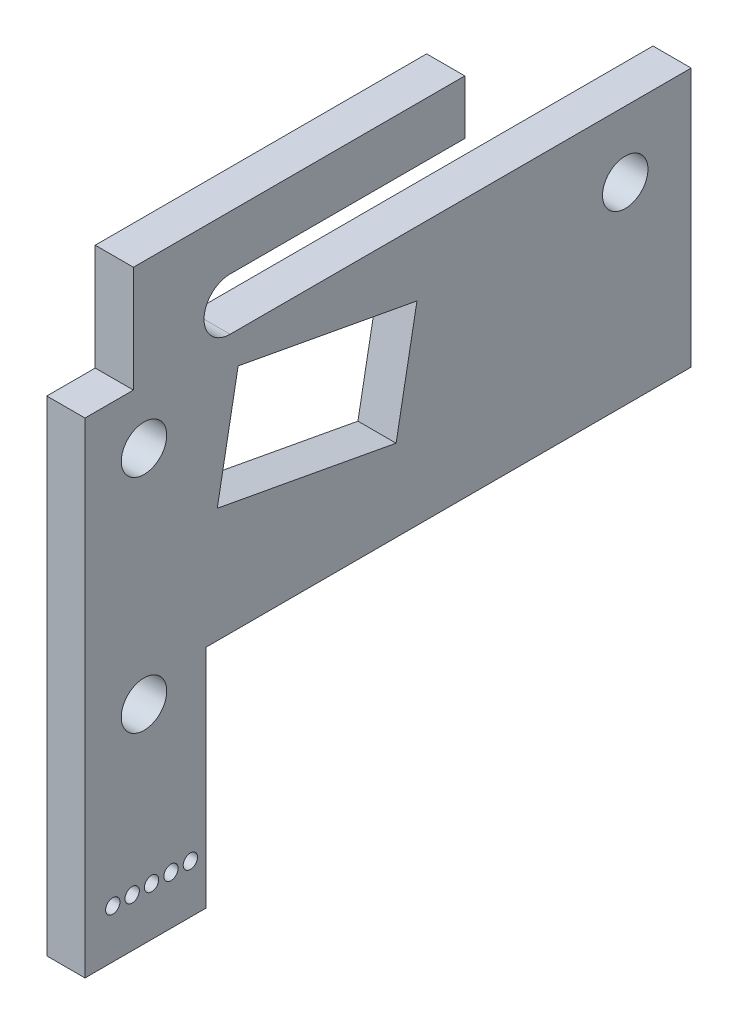
ISO-10303-21;
HEADER;
FILE_DESCRIPTION(('STEP AP214'),'2;1');
FILE_NAME('part.step','',(''),(''),'','','');
FILE_SCHEMA(('AUTOMOTIVE_DESIGN { 1 0 10303 214 1 1 1 1 }'));
ENDSEC;
DATA;
#1=APPLICATION_CONTEXT('core data for automotive mechanical design processes');
#2=APPLICATION_PROTOCOL_DEFINITION('international standard','automotive_design',2000,#1);
#3=PRODUCT_CONTEXT('',#1,'mechanical');
#4=PRODUCT('Part','Part','',(#3));
#5=PRODUCT_RELATED_PRODUCT_CATEGORY('part','',(#4));
#6=PRODUCT_DEFINITION_FORMATION('','',#4);
#7=PRODUCT_DEFINITION_CONTEXT('part definition',#1,'design');
#8=PRODUCT_DEFINITION('design','',#6,#7);
#9=PRODUCT_DEFINITION_SHAPE('','',#8);
#10=(LENGTH_UNIT() NAMED_UNIT(*) SI_UNIT(.MILLI.,.METRE.));
#11=(NAMED_UNIT(*) PLANE_ANGLE_UNIT() SI_UNIT($,.RADIAN.));
#12=(NAMED_UNIT(*) SI_UNIT($,.STERADIAN.) SOLID_ANGLE_UNIT());
#13=UNCERTAINTY_MEASURE_WITH_UNIT(LENGTH_MEASURE(1.E-05),#10,'distance_accuracy_value','');
#14=(GEOMETRIC_REPRESENTATION_CONTEXT(3) GLOBAL_UNCERTAINTY_ASSIGNED_CONTEXT((#13)) GLOBAL_UNIT_ASSIGNED_CONTEXT((#10,
#11,#12)) REPRESENTATION_CONTEXT('',''));
#15=CARTESIAN_POINT('',(0.,0.,0.));
#16=DIRECTION('',(0.,0.,1.));
#17=DIRECTION('',(1.,0.,0.));
#18=AXIS2_PLACEMENT_3D('',#15,#16,#17);
#19=CARTESIAN_POINT('',(2.,9.64169691409352,41.3883309004574));
#20=DIRECTION('',(-1.,0.,0.));
#21=DIRECTION('',(0.,0.,1.));
#22=AXIS2_PLACEMENT_3D('',#19,#20,#21);
#23=PLANE('',#22);
#24=CARTESIAN_POINT('',(2.,-38.8104127217883,53.6809582242048));
#25=DIRECTION('',(1.,0.,0.));
#26=DIRECTION('',(0.,0.,-1.));
#27=AXIS2_PLACEMENT_3D('',#24,#25,#26);
#28=CIRCLE('',#27,0.749999999999999);
#29=CARTESIAN_POINT('',(2.,-38.8104127217883,52.9309582242048));
#30=VERTEX_POINT('',#29);
#31=EDGE_CURVE('E188',#30,#30,#28,.T.);
#32=ORIENTED_EDGE('',*,*,#31,.F.);
#33=EDGE_LOOP('',(#32));
#34=FACE_BOUND('',#33,.T.);
#35=CARTESIAN_POINT('',(2.,0.,0.));
#36=DIRECTION('',(1.,0.,0.));
#37=DIRECTION('',(0.,0.,-1.));
#38=AXIS2_PLACEMENT_3D('',#35,#36,#37);
#39=CIRCLE('',#38,2.38125);
#40=CARTESIAN_POINT('',(2.,0.,-2.38125));
#41=VERTEX_POINT('',#40);
#42=EDGE_CURVE('E194',#41,#41,#39,.T.);
#43=ORIENTED_EDGE('',*,*,#42,.F.);
#44=EDGE_LOOP('',(#43));
#45=FACE_BOUND('',#44,.T.);
#46=DIRECTION('',(0.,-1.,0.));
#47=VECTOR('',#46,1.);
#48=CARTESIAN_POINT('',(2.,6.90958727821171,56.5904127217883));
#49=LINE('',#48,#47);
#50=CARTESIAN_POINT('',(2.,6.90958727821171,56.5904127217883));
#51=VERTEX_POINT('',#50);
#52=CARTESIAN_POINT('',(2.,-43.8904127217883,56.5904127217883));
#53=VERTEX_POINT('',#52);
#54=EDGE_CURVE('E200',#51,#53,#49,.T.);
#55=ORIENTED_EDGE('',*,*,#54,.T.);
#56=DIRECTION('',(0.,0.,-1.));
#57=VECTOR('',#56,1.);
#58=CARTESIAN_POINT('',(2.,-43.8904127217883,56.5904127217883));
#59=LINE('',#58,#57);
#60=CARTESIAN_POINT('',(2.,-43.8904127217883,43.8904127217883));
#61=VERTEX_POINT('',#60);
#62=EDGE_CURVE('E203',#53,#61,#59,.T.);
#63=ORIENTED_EDGE('',*,*,#62,.T.);
#64=DIRECTION('',(0.,1.,0.));
#65=VECTOR('',#64,1.);
#66=CARTESIAN_POINT('',(2.,-43.8904127217883,43.8904127217883));
#67=LINE('',#66,#65);
#68=CARTESIAN_POINT('',(2.,-20.2220575827776,43.8904127217883));
#69=VERTEX_POINT('',#68);
#70=EDGE_CURVE('E206',#61,#69,#67,.T.);
#71=ORIENTED_EDGE('',*,*,#70,.T.);
#72=DIRECTION('',(0.,0.,-1.));
#73=VECTOR('',#72,1.);
#74=CARTESIAN_POINT('',(2.,-20.2220575827776,43.8904127217883));
#75=LINE('',#74,#73);
#76=CARTESIAN_POINT('',(2.,-20.2220575827776,-6.90958727821172));
#77=VERTEX_POINT('',#76);
#78=EDGE_CURVE('E208',#69,#77,#75,.T.);
#79=ORIENTED_EDGE('',*,*,#78,.T.);
#80=DIRECTION('',(0.,1.,0.));
#81=VECTOR('',#80,1.);
#82=CARTESIAN_POINT('',(2.,-20.2220575827776,-6.90958727821172));
#83=LINE('',#82,#81);
#84=CARTESIAN_POINT('',(2.,6.90958727821172,-6.90958727821172));
#85=VERTEX_POINT('',#84);
#86=EDGE_CURVE('E210',#77,#85,#83,.T.);
#87=ORIENTED_EDGE('',*,*,#86,.T.);
#88=DIRECTION('',(0.,0.,1.));
#89=VECTOR('',#88,1.);
#90=CARTESIAN_POINT('',(2.,6.90958727821171,41.3883309004574));
#91=LINE('',#90,#89);
#92=CARTESIAN_POINT('',(2.,6.90958727821171,41.3883309004574));
#93=VERTEX_POINT('',#92);
#94=EDGE_CURVE('E212',#85,#93,#91,.T.);
#95=ORIENTED_EDGE('',*,*,#94,.T.);
#96=CARTESIAN_POINT('',(2.,9.64169691409352,41.3883309004574));
#97=DIRECTION('',(-1.,0.,0.));
#98=DIRECTION('',(0.,0.,1.));
#99=AXIS2_PLACEMENT_3D('',#96,#97,#98);
#100=CIRCLE('',#99,2.73210963588181);
#101=CARTESIAN_POINT('',(2.,12.3738065499753,41.3883309004574));
#102=VERTEX_POINT('',#101);
#103=EDGE_CURVE('E214',#93,#102,#100,.T.);
#104=ORIENTED_EDGE('',*,*,#103,.T.);
#105=DIRECTION('',(0.,0.,-1.));
#106=VECTOR('',#105,1.);
#107=CARTESIAN_POINT('',(2.,12.3738065499753,41.3883309004574));
#108=LINE('',#107,#106);
#109=CARTESIAN_POINT('',(2.,12.3738065499753,16.8039920927754));
#110=VERTEX_POINT('',#109);
#111=EDGE_CURVE('E216',#102,#110,#108,.T.);
#112=ORIENTED_EDGE('',*,*,#111,.T.);
#113=DIRECTION('',(0.,1.,0.));
#114=VECTOR('',#113,1.);
#115=CARTESIAN_POINT('',(2.,12.3738065499753,16.8039920927754));
#116=LINE('',#115,#114);
#117=CARTESIAN_POINT('',(2.,18.0537156021804,16.8039920927754));
#118=VERTEX_POINT('',#117);
#119=EDGE_CURVE('E218',#110,#118,#116,.T.);
#120=ORIENTED_EDGE('',*,*,#119,.T.);
#121=DIRECTION('',(0.,0.,1.));
#122=VECTOR('',#121,1.);
#123=CARTESIAN_POINT('',(2.,18.0537156021804,16.8039920927754));
#124=LINE('',#123,#122);
#125=CARTESIAN_POINT('',(2.,18.0537156021804,51.5186087794746));
#126=VERTEX_POINT('',#125);
#127=EDGE_CURVE('E220',#118,#126,#124,.T.);
#128=ORIENTED_EDGE('',*,*,#127,.T.);
#129=DIRECTION('',(0.,-1.,0.));
#130=VECTOR('',#129,1.);
#131=CARTESIAN_POINT('',(2.,18.0537156021804,51.5186087794746));
#132=LINE('',#131,#130);
#133=CARTESIAN_POINT('',(2.,6.90958727821171,51.5186087794746));
#134=VERTEX_POINT('',#133);
#135=EDGE_CURVE('E222',#126,#134,#132,.T.);
#136=ORIENTED_EDGE('',*,*,#135,.T.);
#137=DIRECTION('',(0.,0.,1.));
#138=VECTOR('',#137,1.);
#139=CARTESIAN_POINT('',(2.,6.90958727821171,56.5904127217883));
#140=LINE('',#139,#138);
#141=EDGE_CURVE('E224',#134,#51,#140,.T.);
#142=ORIENTED_EDGE('',*,*,#141,.T.);
#143=EDGE_LOOP('',(#55,#63,#71,#79,#87,#95,#104,#112,#120,#128,#136,#142));
#144=FACE_BOUND('',#143,.T.);
#145=DIRECTION('',(0.,-0.983319763651573,0.181885245174571));
#146=VECTOR('',#145,1.);
#147=CARTESIAN_POINT('',(2.,3.61240817228016,40.5478550171507));
#148=LINE('',#147,#146);
#149=CARTESIAN_POINT('',(2.,3.61240817228016,40.5478550171507));
#150=VERTEX_POINT('',#149);
#151=CARTESIAN_POINT('',(2.,-8.20328656154539,42.73341114346));
#152=VERTEX_POINT('',#151);
#153=EDGE_CURVE('E149',#150,#152,#148,.T.);
#154=ORIENTED_EDGE('',*,*,#153,.F.);
#155=DIRECTION('',(0.,0.181885245174571,0.983319763651574));
#156=VECTOR('',#155,1.);
#157=CARTESIAN_POINT('',(2.,3.61240817228016,40.5478550171507));
#158=LINE('',#157,#156);
#159=CARTESIAN_POINT('',(2.,0.14749425170459,21.8156135195882));
#160=VERTEX_POINT('',#159);
#161=EDGE_CURVE('E172',#160,#150,#158,.T.);
#162=ORIENTED_EDGE('',*,*,#161,.F.);
#163=DIRECTION('',(0.,0.983319763651573,-0.181885245174571));
#164=VECTOR('',#163,1.);
#165=CARTESIAN_POINT('',(2.,0.147494251704591,21.8156135195882));
#166=LINE('',#165,#164);
#167=CARTESIAN_POINT('',(2.,-11.668200482121,24.0011696458975));
#168=VERTEX_POINT('',#167);
#169=EDGE_CURVE('E170',#168,#160,#166,.T.);
#170=ORIENTED_EDGE('',*,*,#169,.F.);
#171=DIRECTION('',(0.,-0.181885245174571,-0.983319763651574));
#172=VECTOR('',#171,1.);
#173=CARTESIAN_POINT('',(2.,-8.20328656154539,42.73341114346));
#174=LINE('',#173,#172);
#175=EDGE_CURVE('E157',#152,#168,#174,.T.);
#176=ORIENTED_EDGE('',*,*,#175,.F.);
#177=EDGE_LOOP('',(#154,#162,#170,#176));
#178=FACE_BOUND('',#177,.T.);
#179=CARTESIAN_POINT('',(2.,-38.8104127217883,45.5529582242048));
#180=DIRECTION('',(1.,0.,0.));
#181=DIRECTION('',(0.,0.,-1.));
#182=AXIS2_PLACEMENT_3D('',#179,#180,#181);
#183=CIRCLE('',#182,0.749999999999999);
#184=CARTESIAN_POINT('',(2.,-38.8104127217883,44.8029582242048));
#185=VERTEX_POINT('',#184);
#186=EDGE_CURVE('E178',#185,#185,#183,.T.);
#187=ORIENTED_EDGE('',*,*,#186,.F.);
#188=EDGE_LOOP('',(#187));
#189=FACE_BOUND('',#188,.T.);
#190=CARTESIAN_POINT('',(2.,-22.137211246104,50.4101289105847));
#191=DIRECTION('',(1.,0.,0.));
#192=DIRECTION('',(0.,0.,-1.));
#193=AXIS2_PLACEMENT_3D('',#190,#191,#192);
#194=CIRCLE('',#193,2.38125);
#195=CARTESIAN_POINT('',(2.,-22.137211246104,48.0288789105847));
#196=VERTEX_POINT('',#195);
#197=EDGE_CURVE('E599',#196,#196,#194,.T.);
#198=ORIENTED_EDGE('',*,*,#197,.F.);
#199=EDGE_LOOP('',(#198));
#200=FACE_BOUND('',#199,.T.);
#201=CARTESIAN_POINT('',(2.,-38.8104127217883,47.5849582242048));
#202=DIRECTION('',(1.,0.,0.));
#203=DIRECTION('',(0.,0.,-1.));
#204=AXIS2_PLACEMENT_3D('',#201,#202,#203);
#205=CIRCLE('',#204,0.749999999999999);
#206=CARTESIAN_POINT('',(2.,-38.8104127217883,46.8349582242048));
#207=VERTEX_POINT('',#206);
#208=EDGE_CURVE('E593',#207,#207,#205,.T.);
#209=ORIENTED_EDGE('',*,*,#208,.F.);
#210=EDGE_LOOP('',(#209));
#211=FACE_BOUND('',#210,.T.);
#212=CARTESIAN_POINT('',(2.,-38.8104127217883,49.6169582242048));
#213=DIRECTION('',(1.,0.,0.));
#214=DIRECTION('',(0.,0.,-1.));
#215=AXIS2_PLACEMENT_3D('',#212,#213,#214);
#216=CIRCLE('',#215,0.749999999999999);
#217=CARTESIAN_POINT('',(2.,-38.8104127217883,48.8669582242048));
#218=VERTEX_POINT('',#217);
#219=EDGE_CURVE('E587',#218,#218,#216,.T.);
#220=ORIENTED_EDGE('',*,*,#219,.F.);
#221=EDGE_LOOP('',(#220));
#222=FACE_BOUND('',#221,.T.);
#223=CARTESIAN_POINT('',(2.,-38.8104127217883,51.6489582242048));
#224=DIRECTION('',(1.,0.,0.));
#225=DIRECTION('',(0.,0.,-1.));
#226=AXIS2_PLACEMENT_3D('',#223,#224,#225);
#227=CIRCLE('',#226,0.749999999999999);
#228=CARTESIAN_POINT('',(2.,-38.8104127217883,50.8989582242048));
#229=VERTEX_POINT('',#228);
#230=EDGE_CURVE('E581',#229,#229,#227,.T.);
#231=ORIENTED_EDGE('',*,*,#230,.F.);
#232=EDGE_LOOP('',(#231));
#233=FACE_BOUND('',#232,.T.);
#234=CARTESIAN_POINT('',(2.,1.07937569190719,50.4101289105847));
#235=DIRECTION('',(1.,0.,0.));
#236=DIRECTION('',(0.,0.,-1.));
#237=AXIS2_PLACEMENT_3D('',#234,#235,#236);
#238=CIRCLE('',#237,2.38125);
#239=CARTESIAN_POINT('',(2.,1.07937569190719,48.0288789105847));
#240=VERTEX_POINT('',#239);
#241=EDGE_CURVE('E572',#240,#240,#238,.T.);
#242=ORIENTED_EDGE('',*,*,#241,.F.);
#243=EDGE_LOOP('',(#242));
#244=FACE_BOUND('',#243,.T.);
#245=ADVANCED_FACE('F36',(#34,#45,#144,#178,#189,#200,#211,#222,#233,#244),#23,.F.);
#246=CARTESIAN_POINT('',(-2.,9.64169691409352,41.3883309004574));
#247=DIRECTION('',(-1.,0.,0.));
#248=DIRECTION('',(0.,0.,1.));
#249=AXIS2_PLACEMENT_3D('',#246,#247,#248);
#250=PLANE('',#249);
#251=CARTESIAN_POINT('',(-2.,-38.8104127217883,51.6489582242048));
#252=DIRECTION('',(1.,0.,0.));
#253=DIRECTION('',(0.,0.,-1.));
#254=AXIS2_PLACEMENT_3D('',#251,#252,#253);
#255=CIRCLE('',#254,0.749999999999999);
#256=CARTESIAN_POINT('',(-2.,-38.8104127217883,50.8989582242048));
#257=VERTEX_POINT('',#256);
#258=EDGE_CURVE('E578',#257,#257,#255,.T.);
#259=ORIENTED_EDGE('',*,*,#258,.T.);
#260=EDGE_LOOP('',(#259));
#261=FACE_BOUND('',#260,.T.);
#262=CARTESIAN_POINT('',(-2.,-38.8104127217883,47.5849582242048));
#263=DIRECTION('',(1.,0.,0.));
#264=DIRECTION('',(0.,0.,-1.));
#265=AXIS2_PLACEMENT_3D('',#262,#263,#264);
#266=CIRCLE('',#265,0.749999999999999);
#267=CARTESIAN_POINT('',(-2.,-38.8104127217883,46.8349582242048));
#268=VERTEX_POINT('',#267);
#269=EDGE_CURVE('E590',#268,#268,#266,.T.);
#270=ORIENTED_EDGE('',*,*,#269,.T.);
#271=EDGE_LOOP('',(#270));
#272=FACE_BOUND('',#271,.T.);
#273=CARTESIAN_POINT('',(-2.,-38.8104127217883,45.5529582242048));
#274=DIRECTION('',(1.,0.,0.));
#275=DIRECTION('',(0.,0.,-1.));
#276=AXIS2_PLACEMENT_3D('',#273,#274,#275);
#277=CIRCLE('',#276,0.749999999999999);
#278=CARTESIAN_POINT('',(-2.,-38.8104127217883,44.8029582242048));
#279=VERTEX_POINT('',#278);
#280=EDGE_CURVE('E602',#279,#279,#277,.T.);
#281=ORIENTED_EDGE('',*,*,#280,.T.);
#282=EDGE_LOOP('',(#281));
#283=FACE_BOUND('',#282,.T.);
#284=CARTESIAN_POINT('',(-2.,0.,0.));
#285=DIRECTION('',(1.,0.,0.));
#286=DIRECTION('',(0.,0.,-1.));
#287=AXIS2_PLACEMENT_3D('',#284,#285,#286);
#288=CIRCLE('',#287,2.38125);
#289=CARTESIAN_POINT('',(-2.,0.,-2.38125));
#290=VERTEX_POINT('',#289);
#291=EDGE_CURVE('E191',#290,#290,#288,.T.);
#292=ORIENTED_EDGE('',*,*,#291,.T.);
#293=EDGE_LOOP('',(#292));
#294=FACE_BOUND('',#293,.T.);
#295=DIRECTION('',(0.,-1.,0.));
#296=VECTOR('',#295,1.);
#297=CARTESIAN_POINT('',(-2.,6.90958727821171,56.5904127217883));
#298=LINE('',#297,#296);
#299=CARTESIAN_POINT('',(-2.,6.90958727821171,56.5904127217883));
#300=VERTEX_POINT('',#299);
#301=CARTESIAN_POINT('',(-2.,-43.8904127217883,56.5904127217883));
#302=VERTEX_POINT('',#301);
#303=EDGE_CURVE('E197',#300,#302,#298,.T.);
#304=ORIENTED_EDGE('',*,*,#303,.F.);
#305=DIRECTION('',(0.,0.,1.));
#306=VECTOR('',#305,1.);
#307=CARTESIAN_POINT('',(-2.,6.90958727821171,56.5904127217883));
#308=LINE('',#307,#306);
#309=CARTESIAN_POINT('',(-2.,6.90958727821171,51.5186087794746));
#310=VERTEX_POINT('',#309);
#311=EDGE_CURVE('E204',#310,#300,#308,.T.);
#312=ORIENTED_EDGE('',*,*,#311,.F.);
#313=DIRECTION('',(0.,-1.,0.));
#314=VECTOR('',#313,1.);
#315=CARTESIAN_POINT('',(-2.,18.0537156021804,51.5186087794746));
#316=LINE('',#315,#314);
#317=CARTESIAN_POINT('',(-2.,18.0537156021804,51.5186087794746));
#318=VERTEX_POINT('',#317);
#319=EDGE_CURVE('E247',#318,#310,#316,.T.);
#320=ORIENTED_EDGE('',*,*,#319,.F.);
#321=DIRECTION('',(0.,0.,1.));
#322=VECTOR('',#321,1.);
#323=CARTESIAN_POINT('',(-2.,18.0537156021804,16.8039920927754));
#324=LINE('',#323,#322);
#325=CARTESIAN_POINT('',(-2.,18.0537156021804,16.8039920927754));
#326=VERTEX_POINT('',#325);
#327=EDGE_CURVE('E245',#326,#318,#324,.T.);
#328=ORIENTED_EDGE('',*,*,#327,.F.);
#329=DIRECTION('',(0.,1.,0.));
#330=VECTOR('',#329,1.);
#331=CARTESIAN_POINT('',(-2.,12.3738065499753,16.8039920927754));
#332=LINE('',#331,#330);
#333=CARTESIAN_POINT('',(-2.,12.3738065499753,16.8039920927754));
#334=VERTEX_POINT('',#333);
#335=EDGE_CURVE('E243',#334,#326,#332,.T.);
#336=ORIENTED_EDGE('',*,*,#335,.F.);
#337=DIRECTION('',(0.,0.,-1.));
#338=VECTOR('',#337,1.);
#339=CARTESIAN_POINT('',(-2.,12.3738065499753,41.3883309004574));
#340=LINE('',#339,#338);
#341=CARTESIAN_POINT('',(-2.,12.3738065499753,41.3883309004574));
#342=VERTEX_POINT('',#341);
#343=EDGE_CURVE('E241',#342,#334,#340,.T.);
#344=ORIENTED_EDGE('',*,*,#343,.F.);
#345=CARTESIAN_POINT('',(-2.,9.64169691409352,41.3883309004574));
#346=DIRECTION('',(-1.,0.,0.));
#347=DIRECTION('',(0.,0.,1.));
#348=AXIS2_PLACEMENT_3D('',#345,#346,#347);
#349=CIRCLE('',#348,2.73210963588181);
#350=CARTESIAN_POINT('',(-2.,6.90958727821171,41.3883309004574));
#351=VERTEX_POINT('',#350);
#352=EDGE_CURVE('E239',#351,#342,#349,.T.);
#353=ORIENTED_EDGE('',*,*,#352,.F.);
#354=DIRECTION('',(0.,0.,1.));
#355=VECTOR('',#354,1.);
#356=CARTESIAN_POINT('',(-2.,6.90958727821171,41.3883309004574));
#357=LINE('',#356,#355);
#358=CARTESIAN_POINT('',(-2.,6.90958727821172,-6.90958727821172));
#359=VERTEX_POINT('',#358);
#360=EDGE_CURVE('E237',#359,#351,#357,.T.);
#361=ORIENTED_EDGE('',*,*,#360,.F.);
#362=DIRECTION('',(0.,1.,0.));
#363=VECTOR('',#362,1.);
#364=CARTESIAN_POINT('',(-2.,-20.2220575827776,-6.90958727821172));
#365=LINE('',#364,#363);
#366=CARTESIAN_POINT('',(-2.,-20.2220575827776,-6.90958727821172));
#367=VERTEX_POINT('',#366);
#368=EDGE_CURVE('E235',#367,#359,#365,.T.);
#369=ORIENTED_EDGE('',*,*,#368,.F.);
#370=DIRECTION('',(0.,0.,-1.));
#371=VECTOR('',#370,1.);
#372=CARTESIAN_POINT('',(-2.,-20.2220575827776,43.8904127217883));
#373=LINE('',#372,#371);
#374=CARTESIAN_POINT('',(-2.,-20.2220575827776,43.8904127217883));
#375=VERTEX_POINT('',#374);
#376=EDGE_CURVE('E233',#375,#367,#373,.T.);
#377=ORIENTED_EDGE('',*,*,#376,.F.);
#378=DIRECTION('',(0.,1.,0.));
#379=VECTOR('',#378,1.);
#380=CARTESIAN_POINT('',(-2.,-43.8904127217883,43.8904127217883));
#381=LINE('',#380,#379);
#382=CARTESIAN_POINT('',(-2.,-43.8904127217883,43.8904127217883));
#383=VERTEX_POINT('',#382);
#384=EDGE_CURVE('E231',#383,#375,#381,.T.);
#385=ORIENTED_EDGE('',*,*,#384,.F.);
#386=DIRECTION('',(0.,0.,-1.));
#387=VECTOR('',#386,1.);
#388=CARTESIAN_POINT('',(-2.,-43.8904127217883,56.5904127217883));
#389=LINE('',#388,#387);
#390=EDGE_CURVE('E229',#302,#383,#389,.T.);
#391=ORIENTED_EDGE('',*,*,#390,.F.);
#392=EDGE_LOOP('',(#304,#312,#320,#328,#336,#344,#353,#361,#369,#377,#385,#391));
#393=FACE_BOUND('',#392,.T.);
#394=CARTESIAN_POINT('',(-2.,-38.8104127217883,53.6809582242048));
#395=DIRECTION('',(1.,0.,0.));
#396=DIRECTION('',(0.,0.,-1.));
#397=AXIS2_PLACEMENT_3D('',#394,#395,#396);
#398=CIRCLE('',#397,0.749999999999999);
#399=CARTESIAN_POINT('',(-2.,-38.8104127217883,52.9309582242048));
#400=VERTEX_POINT('',#399);
#401=EDGE_CURVE('E165',#400,#400,#398,.T.);
#402=ORIENTED_EDGE('',*,*,#401,.T.);
#403=EDGE_LOOP('',(#402));
#404=FACE_BOUND('',#403,.T.);
#405=DIRECTION('',(0.,0.181885245174571,0.983319763651574));
#406=VECTOR('',#405,1.);
#407=CARTESIAN_POINT('',(-2.,3.61240817228016,40.5478550171507));
#408=LINE('',#407,#406);
#409=CARTESIAN_POINT('',(-2.,0.147494251704591,21.8156135195882));
#410=VERTEX_POINT('',#409);
#411=CARTESIAN_POINT('',(-2.,3.61240817228016,40.5478550171507));
#412=VERTEX_POINT('',#411);
#413=EDGE_CURVE('E158',#410,#412,#408,.T.);
#414=ORIENTED_EDGE('',*,*,#413,.T.);
#415=DIRECTION('',(0.,-0.983319763651573,0.181885245174571));
#416=VECTOR('',#415,1.);
#417=CARTESIAN_POINT('',(-2.,3.61240817228016,40.5478550171507));
#418=LINE('',#417,#416);
#419=CARTESIAN_POINT('',(-2.,-8.20328656154539,42.73341114346));
#420=VERTEX_POINT('',#419);
#421=EDGE_CURVE('E59',#412,#420,#418,.T.);
#422=ORIENTED_EDGE('',*,*,#421,.T.);
#423=DIRECTION('',(0.,-0.181885245174571,-0.983319763651574));
#424=VECTOR('',#423,1.);
#425=CARTESIAN_POINT('',(-2.,-8.20328656154539,42.73341114346));
#426=LINE('',#425,#424);
#427=CARTESIAN_POINT('',(-2.,-11.668200482121,24.0011696458975));
#428=VERTEX_POINT('',#427);
#429=EDGE_CURVE('E164',#420,#428,#426,.T.);
#430=ORIENTED_EDGE('',*,*,#429,.T.);
#431=DIRECTION('',(0.,0.983319763651573,-0.181885245174571));
#432=VECTOR('',#431,1.);
#433=CARTESIAN_POINT('',(-2.,0.147494251704591,21.8156135195882));
#434=LINE('',#433,#432);
#435=EDGE_CURVE('E180',#428,#410,#434,.T.);
#436=ORIENTED_EDGE('',*,*,#435,.T.);
#437=EDGE_LOOP('',(#414,#422,#430,#436));
#438=FACE_BOUND('',#437,.T.);
#439=CARTESIAN_POINT('',(-2.,-22.137211246104,50.4101289105847));
#440=DIRECTION('',(1.,0.,0.));
#441=DIRECTION('',(0.,0.,-1.));
#442=AXIS2_PLACEMENT_3D('',#439,#440,#441);
#443=CIRCLE('',#442,2.38125);
#444=CARTESIAN_POINT('',(-2.,-22.137211246104,48.0288789105847));
#445=VERTEX_POINT('',#444);
#446=EDGE_CURVE('E596',#445,#445,#443,.T.);
#447=ORIENTED_EDGE('',*,*,#446,.T.);
#448=EDGE_LOOP('',(#447));
#449=FACE_BOUND('',#448,.T.);
#450=CARTESIAN_POINT('',(-2.,-38.8104127217883,49.6169582242048));
#451=DIRECTION('',(1.,0.,0.));
#452=DIRECTION('',(0.,0.,-1.));
#453=AXIS2_PLACEMENT_3D('',#450,#451,#452);
#454=CIRCLE('',#453,0.749999999999999);
#455=CARTESIAN_POINT('',(-2.,-38.8104127217883,48.8669582242048));
#456=VERTEX_POINT('',#455);
#457=EDGE_CURVE('E584',#456,#456,#454,.T.);
#458=ORIENTED_EDGE('',*,*,#457,.T.);
#459=EDGE_LOOP('',(#458));
#460=FACE_BOUND('',#459,.T.);
#461=CARTESIAN_POINT('',(-2.,1.07937569190719,50.4101289105847));
#462=DIRECTION('',(1.,0.,0.));
#463=DIRECTION('',(0.,0.,-1.));
#464=AXIS2_PLACEMENT_3D('',#461,#462,#463);
#465=CIRCLE('',#464,2.38125);
#466=CARTESIAN_POINT('',(-2.,1.07937569190719,48.0288789105847));
#467=VERTEX_POINT('',#466);
#468=EDGE_CURVE('E575',#467,#467,#465,.T.);
#469=ORIENTED_EDGE('',*,*,#468,.T.);
#470=EDGE_LOOP('',(#469));
#471=FACE_BOUND('',#470,.T.);
#472=ADVANCED_FACE('F289',(#261,#272,#283,#294,#393,#404,#438,#449,#460,#471),#250,.T.);
#473=CARTESIAN_POINT('',(2.,6.90958727821171,56.5904127217883));
#474=DIRECTION('',(0.,0.,-1.));
#475=DIRECTION('',(0.,1.,0.));
#476=AXIS2_PLACEMENT_3D('',#473,#474,#475);
#477=PLANE('',#476);
#478=ORIENTED_EDGE('',*,*,#303,.T.);
#479=DIRECTION('',(-1.,0.,0.));
#480=VECTOR('',#479,1.);
#481=CARTESIAN_POINT('',(2.,-43.8904127217883,56.5904127217883));
#482=LINE('',#481,#480);
#483=EDGE_CURVE('E11',#53,#302,#482,.T.);
#484=ORIENTED_EDGE('',*,*,#483,.F.);
#485=ORIENTED_EDGE('',*,*,#54,.F.);
#486=DIRECTION('',(-1.,0.,0.));
#487=VECTOR('',#486,1.);
#488=CARTESIAN_POINT('',(2.,6.90958727821171,56.5904127217883));
#489=LINE('',#488,#487);
#490=EDGE_CURVE('E226',#51,#300,#489,.T.);
#491=ORIENTED_EDGE('',*,*,#490,.T.);
#492=EDGE_LOOP('',(#478,#484,#485,#491));
#493=FACE_BOUND('',#492,.T.);
#494=ADVANCED_FACE('F38',(#493),#477,.F.);
#495=CARTESIAN_POINT('',(2.,-43.8904127217883,56.5904127217883));
#496=DIRECTION('',(0.,1.,0.));
#497=DIRECTION('',(0.,0.,1.));
#498=AXIS2_PLACEMENT_3D('',#495,#496,#497);
#499=PLANE('',#498);
#500=ORIENTED_EDGE('',*,*,#390,.T.);
#501=DIRECTION('',(-1.,0.,0.));
#502=VECTOR('',#501,1.);
#503=CARTESIAN_POINT('',(2.,-43.8904127217883,43.8904127217883));
#504=LINE('',#503,#502);
#505=EDGE_CURVE('E44',#61,#383,#504,.T.);
#506=ORIENTED_EDGE('',*,*,#505,.F.);
#507=ORIENTED_EDGE('',*,*,#62,.F.);
#508=ORIENTED_EDGE('',*,*,#483,.T.);
#509=EDGE_LOOP('',(#500,#506,#507,#508));
#510=FACE_BOUND('',#509,.T.);
#511=ADVANCED_FACE('F306',(#510),#499,.F.);
#512=CARTESIAN_POINT('',(2.,-43.8904127217883,43.8904127217883));
#513=DIRECTION('',(0.,0.,1.));
#514=DIRECTION('',(1.,0.,0.));
#515=AXIS2_PLACEMENT_3D('',#512,#513,#514);
#516=PLANE('',#515);
#517=ORIENTED_EDGE('',*,*,#384,.T.);
#518=DIRECTION('',(-1.,0.,0.));
#519=VECTOR('',#518,1.);
#520=CARTESIAN_POINT('',(2.,-20.2220575827776,43.8904127217883));
#521=LINE('',#520,#519);
#522=EDGE_CURVE('E276',#69,#375,#521,.T.);
#523=ORIENTED_EDGE('',*,*,#522,.F.);
#524=ORIENTED_EDGE('',*,*,#70,.F.);
#525=ORIENTED_EDGE('',*,*,#505,.T.);
#526=EDGE_LOOP('',(#517,#523,#524,#525));
#527=FACE_BOUND('',#526,.T.);
#528=ADVANCED_FACE('F283',(#527),#516,.F.);
#529=CARTESIAN_POINT('',(2.,-20.2220575827776,43.8904127217883));
#530=DIRECTION('',(0.,1.,0.));
#531=DIRECTION('',(0.,0.,1.));
#532=AXIS2_PLACEMENT_3D('',#529,#530,#531);
#533=PLANE('',#532);
#534=ORIENTED_EDGE('',*,*,#376,.T.);
#535=DIRECTION('',(-1.,0.,0.));
#536=VECTOR('',#535,1.);
#537=CARTESIAN_POINT('',(2.,-20.2220575827776,-6.90958727821172));
#538=LINE('',#537,#536);
#539=EDGE_CURVE('E273',#77,#367,#538,.T.);
#540=ORIENTED_EDGE('',*,*,#539,.F.);
#541=ORIENTED_EDGE('',*,*,#78,.F.);
#542=ORIENTED_EDGE('',*,*,#522,.T.);
#543=EDGE_LOOP('',(#534,#540,#541,#542));
#544=FACE_BOUND('',#543,.T.);
#545=ADVANCED_FACE('F295',(#544),#533,.F.);
#546=CARTESIAN_POINT('',(2.,-20.2220575827776,-6.90958727821172));
#547=DIRECTION('',(0.,0.,1.));
#548=DIRECTION('',(1.,0.,0.));
#549=AXIS2_PLACEMENT_3D('',#546,#547,#548);
#550=PLANE('',#549);
#551=ORIENTED_EDGE('',*,*,#368,.T.);
#552=DIRECTION('',(-1.,0.,0.));
#553=VECTOR('',#552,1.);
#554=CARTESIAN_POINT('',(2.,6.90958727821172,-6.90958727821172));
#555=LINE('',#554,#553);
#556=EDGE_CURVE('E270',#85,#359,#555,.T.);
#557=ORIENTED_EDGE('',*,*,#556,.F.);
#558=ORIENTED_EDGE('',*,*,#86,.F.);
#559=ORIENTED_EDGE('',*,*,#539,.T.);
#560=EDGE_LOOP('',(#551,#557,#558,#559));
#561=FACE_BOUND('',#560,.T.);
#562=ADVANCED_FACE('F299',(#561),#550,.F.);
#563=CARTESIAN_POINT('',(2.,6.90958727821171,41.3883309004574));
#564=DIRECTION('',(0.,-1.,0.));
#565=DIRECTION('',(0.,0.,-1.));
#566=AXIS2_PLACEMENT_3D('',#563,#564,#565);
#567=PLANE('',#566);
#568=ORIENTED_EDGE('',*,*,#360,.T.);
#569=DIRECTION('',(-1.,0.,0.));
#570=VECTOR('',#569,1.);
#571=CARTESIAN_POINT('',(2.,6.90958727821171,41.3883309004574));
#572=LINE('',#571,#570);
#573=EDGE_CURVE('E267',#93,#351,#572,.T.);
#574=ORIENTED_EDGE('',*,*,#573,.F.);
#575=ORIENTED_EDGE('',*,*,#94,.F.);
#576=ORIENTED_EDGE('',*,*,#556,.T.);
#577=EDGE_LOOP('',(#568,#574,#575,#576));
#578=FACE_BOUND('',#577,.T.);
#579=ADVANCED_FACE('F339',(#578),#567,.F.);
#580=CARTESIAN_POINT('',(2.,9.64169691409352,41.3883309004574));
#581=DIRECTION('',(-1.,0.,0.));
#582=DIRECTION('',(0.,0.,1.));
#583=AXIS2_PLACEMENT_3D('',#580,#581,#582);
#584=CYLINDRICAL_SURFACE('',#583,2.73210963588181);
#585=ORIENTED_EDGE('',*,*,#352,.T.);
#586=DIRECTION('',(-1.,0.,0.));
#587=VECTOR('',#586,1.);
#588=CARTESIAN_POINT('',(2.,12.3738065499753,41.3883309004574));
#589=LINE('',#588,#587);
#590=EDGE_CURVE('E264',#102,#342,#589,.T.);
#591=ORIENTED_EDGE('',*,*,#590,.F.);
#592=ORIENTED_EDGE('',*,*,#103,.F.);
#593=ORIENTED_EDGE('',*,*,#573,.T.);
#594=EDGE_LOOP('',(#585,#591,#592,#593));
#595=FACE_BOUND('',#594,.T.);
#596=ADVANCED_FACE('F337',(#595),#584,.F.);
#597=CARTESIAN_POINT('',(2.,12.3738065499753,41.3883309004574));
#598=DIRECTION('',(0.,1.,0.));
#599=DIRECTION('',(0.,0.,1.));
#600=AXIS2_PLACEMENT_3D('',#597,#598,#599);
#601=PLANE('',#600);
#602=ORIENTED_EDGE('',*,*,#343,.T.);
#603=DIRECTION('',(-1.,0.,0.));
#604=VECTOR('',#603,1.);
#605=CARTESIAN_POINT('',(2.,12.3738065499753,16.8039920927754));
#606=LINE('',#605,#604);
#607=EDGE_CURVE('E261',#110,#334,#606,.T.);
#608=ORIENTED_EDGE('',*,*,#607,.F.);
#609=ORIENTED_EDGE('',*,*,#111,.F.);
#610=ORIENTED_EDGE('',*,*,#590,.T.);
#611=EDGE_LOOP('',(#602,#608,#609,#610));
#612=FACE_BOUND('',#611,.T.);
#613=ADVANCED_FACE('F333',(#612),#601,.F.);
#614=CARTESIAN_POINT('',(2.,12.3738065499753,16.8039920927754));
#615=DIRECTION('',(0.,0.,1.));
#616=DIRECTION('',(1.,0.,0.));
#617=AXIS2_PLACEMENT_3D('',#614,#615,#616);
#618=PLANE('',#617);
#619=ORIENTED_EDGE('',*,*,#335,.T.);
#620=DIRECTION('',(-1.,0.,0.));
#621=VECTOR('',#620,1.);
#622=CARTESIAN_POINT('',(2.,18.0537156021804,16.8039920927754));
#623=LINE('',#622,#621);
#624=EDGE_CURVE('E258',#118,#326,#623,.T.);
#625=ORIENTED_EDGE('',*,*,#624,.F.);
#626=ORIENTED_EDGE('',*,*,#119,.F.);
#627=ORIENTED_EDGE('',*,*,#607,.T.);
#628=EDGE_LOOP('',(#619,#625,#626,#627));
#629=FACE_BOUND('',#628,.T.);
#630=ADVANCED_FACE('F328',(#629),#618,.F.);
#631=CARTESIAN_POINT('',(2.,18.0537156021804,16.8039920927754));
#632=DIRECTION('',(0.,-1.,0.));
#633=DIRECTION('',(0.,0.,-1.));
#634=AXIS2_PLACEMENT_3D('',#631,#632,#633);
#635=PLANE('',#634);
#636=ORIENTED_EDGE('',*,*,#327,.T.);
#637=DIRECTION('',(-1.,0.,0.));
#638=VECTOR('',#637,1.);
#639=CARTESIAN_POINT('',(2.,18.0537156021804,51.5186087794746));
#640=LINE('',#639,#638);
#641=EDGE_CURVE('E255',#126,#318,#640,.T.);
#642=ORIENTED_EDGE('',*,*,#641,.F.);
#643=ORIENTED_EDGE('',*,*,#127,.F.);
#644=ORIENTED_EDGE('',*,*,#624,.T.);
#645=EDGE_LOOP('',(#636,#642,#643,#644));
#646=FACE_BOUND('',#645,.T.);
#647=ADVANCED_FACE('F322',(#646),#635,.F.);
#648=CARTESIAN_POINT('',(2.,18.0537156021804,51.5186087794746));
#649=DIRECTION('',(0.,0.,-1.));
#650=DIRECTION('',(-1.,0.,0.));
#651=AXIS2_PLACEMENT_3D('',#648,#649,#650);
#652=PLANE('',#651);
#653=ORIENTED_EDGE('',*,*,#319,.T.);
#654=DIRECTION('',(-1.,0.,0.));
#655=VECTOR('',#654,1.);
#656=CARTESIAN_POINT('',(2.,6.90958727821171,51.5186087794746));
#657=LINE('',#656,#655);
#658=EDGE_CURVE('E252',#134,#310,#657,.T.);
#659=ORIENTED_EDGE('',*,*,#658,.F.);
#660=ORIENTED_EDGE('',*,*,#135,.F.);
#661=ORIENTED_EDGE('',*,*,#641,.T.);
#662=EDGE_LOOP('',(#653,#659,#660,#661));
#663=FACE_BOUND('',#662,.T.);
#664=ADVANCED_FACE('F318',(#663),#652,.F.);
#665=CARTESIAN_POINT('',(2.,6.90958727821171,56.5904127217883));
#666=DIRECTION('',(0.,-1.,0.));
#667=DIRECTION('',(0.,0.,-1.));
#668=AXIS2_PLACEMENT_3D('',#665,#666,#667);
#669=PLANE('',#668);
#670=ORIENTED_EDGE('',*,*,#311,.T.);
#671=ORIENTED_EDGE('',*,*,#490,.F.);
#672=ORIENTED_EDGE('',*,*,#141,.F.);
#673=ORIENTED_EDGE('',*,*,#658,.T.);
#674=EDGE_LOOP('',(#670,#671,#672,#673));
#675=FACE_BOUND('',#674,.T.);
#676=ADVANCED_FACE('F313',(#675),#669,.F.);
#677=CARTESIAN_POINT('',(2.,0.,0.));
#678=DIRECTION('',(-1.,0.,0.));
#679=DIRECTION('',(0.,0.,1.));
#680=AXIS2_PLACEMENT_3D('',#677,#678,#679);
#681=CYLINDRICAL_SURFACE('',#680,2.38125);
#682=ORIENTED_EDGE('',*,*,#42,.T.);
#683=EDGE_LOOP('',(#682));
#684=FACE_BOUND('',#683,.T.);
#685=ORIENTED_EDGE('',*,*,#291,.F.);
#686=EDGE_LOOP('',(#685));
#687=FACE_BOUND('',#686,.T.);
#688=ADVANCED_FACE('F359',(#684,#687),#681,.F.);
#689=CARTESIAN_POINT('',(2.,-38.8104127217883,53.6809582242048));
#690=DIRECTION('',(-1.,0.,0.));
#691=DIRECTION('',(0.,0.,1.));
#692=AXIS2_PLACEMENT_3D('',#689,#690,#691);
#693=CYLINDRICAL_SURFACE('',#692,0.749999999999999);
#694=ORIENTED_EDGE('',*,*,#31,.T.);
#695=EDGE_LOOP('',(#694));
#696=FACE_BOUND('',#695,.T.);
#697=ORIENTED_EDGE('',*,*,#401,.F.);
#698=EDGE_LOOP('',(#697));
#699=FACE_BOUND('',#698,.T.);
#700=ADVANCED_FACE('F397',(#696,#699),#693,.F.);
#701=CARTESIAN_POINT('',(2.,3.61240817228016,40.5478550171507));
#702=DIRECTION('',(0.,-0.181885245174571,-0.983319763651573));
#703=DIRECTION('',(0.,0.983319763651573,-0.181885245174571));
#704=AXIS2_PLACEMENT_3D('',#701,#702,#703);
#705=PLANE('',#704);
#706=ORIENTED_EDGE('',*,*,#421,.F.);
#707=DIRECTION('',(-1.,0.,0.));
#708=VECTOR('',#707,1.);
#709=CARTESIAN_POINT('',(2.,3.61240817228016,40.5478550171507));
#710=LINE('',#709,#708);
#711=EDGE_CURVE('E153',#150,#412,#710,.T.);
#712=ORIENTED_EDGE('',*,*,#711,.F.);
#713=ORIENTED_EDGE('',*,*,#153,.T.);
#714=DIRECTION('',(-1.,0.,0.));
#715=VECTOR('',#714,1.);
#716=CARTESIAN_POINT('',(2.,-8.20328656154539,42.73341114346));
#717=LINE('',#716,#715);
#718=EDGE_CURVE('E152',#152,#420,#717,.T.);
#719=ORIENTED_EDGE('',*,*,#718,.T.);
#720=EDGE_LOOP('',(#706,#712,#713,#719));
#721=FACE_BOUND('',#720,.T.);
#722=ADVANCED_FACE('F151',(#721),#705,.T.);
#723=CARTESIAN_POINT('',(2.,-8.20328656154539,42.73341114346));
#724=DIRECTION('',(0.,0.983319763651573,-0.181885245174571));
#725=DIRECTION('',(0.,0.181885245174571,0.983319763651573));
#726=AXIS2_PLACEMENT_3D('',#723,#724,#725);
#727=PLANE('',#726);
#728=ORIENTED_EDGE('',*,*,#429,.F.);
#729=ORIENTED_EDGE('',*,*,#718,.F.);
#730=ORIENTED_EDGE('',*,*,#175,.T.);
#731=DIRECTION('',(-1.,0.,0.));
#732=VECTOR('',#731,1.);
#733=CARTESIAN_POINT('',(2.,-11.668200482121,24.0011696458975));
#734=LINE('',#733,#732);
#735=EDGE_CURVE('E166',#168,#428,#734,.T.);
#736=ORIENTED_EDGE('',*,*,#735,.T.);
#737=EDGE_LOOP('',(#728,#729,#730,#736));
#738=FACE_BOUND('',#737,.T.);
#739=ADVANCED_FACE('F161',(#738),#727,.T.);
#740=CARTESIAN_POINT('',(2.,0.147494251704591,21.8156135195882));
#741=DIRECTION('',(0.,0.181885245174571,0.983319763651573));
#742=DIRECTION('',(0.,-0.983319763651573,0.181885245174571));
#743=AXIS2_PLACEMENT_3D('',#740,#741,#742);
#744=PLANE('',#743);
#745=ORIENTED_EDGE('',*,*,#435,.F.);
#746=ORIENTED_EDGE('',*,*,#735,.F.);
#747=ORIENTED_EDGE('',*,*,#169,.T.);
#748=DIRECTION('',(-1.,0.,0.));
#749=VECTOR('',#748,1.);
#750=CARTESIAN_POINT('',(2.,0.147494251704591,21.8156135195882));
#751=LINE('',#750,#749);
#752=EDGE_CURVE('E51',#160,#410,#751,.T.);
#753=ORIENTED_EDGE('',*,*,#752,.T.);
#754=EDGE_LOOP('',(#745,#746,#747,#753));
#755=FACE_BOUND('',#754,.T.);
#756=ADVANCED_FACE('F416',(#755),#744,.T.);
#757=CARTESIAN_POINT('',(2.,3.61240817228016,40.5478550171507));
#758=DIRECTION('',(0.,-0.983319763651573,0.181885245174571));
#759=DIRECTION('',(0.,-0.181885245174571,-0.983319763651573));
#760=AXIS2_PLACEMENT_3D('',#757,#758,#759);
#761=PLANE('',#760);
#762=ORIENTED_EDGE('',*,*,#413,.F.);
#763=ORIENTED_EDGE('',*,*,#752,.F.);
#764=ORIENTED_EDGE('',*,*,#161,.T.);
#765=ORIENTED_EDGE('',*,*,#711,.T.);
#766=EDGE_LOOP('',(#762,#763,#764,#765));
#767=FACE_BOUND('',#766,.T.);
#768=ADVANCED_FACE('F423',(#767),#761,.T.);
#769=CARTESIAN_POINT('',(2.,-38.8104127217883,45.5529582242048));
#770=DIRECTION('',(-1.,0.,0.));
#771=DIRECTION('',(0.,0.,1.));
#772=AXIS2_PLACEMENT_3D('',#769,#770,#771);
#773=CYLINDRICAL_SURFACE('',#772,0.749999999999999);
#774=ORIENTED_EDGE('',*,*,#186,.T.);
#775=EDGE_LOOP('',(#774));
#776=FACE_BOUND('',#775,.T.);
#777=ORIENTED_EDGE('',*,*,#280,.F.);
#778=EDGE_LOOP('',(#777));
#779=FACE_BOUND('',#778,.T.);
#780=ADVANCED_FACE('F431',(#776,#779),#773,.F.);
#781=CARTESIAN_POINT('',(2.,-22.137211246104,50.4101289105847));
#782=DIRECTION('',(-1.,0.,0.));
#783=DIRECTION('',(0.,0.,1.));
#784=AXIS2_PLACEMENT_3D('',#781,#782,#783);
#785=CYLINDRICAL_SURFACE('',#784,2.38125);
#786=ORIENTED_EDGE('',*,*,#197,.T.);
#787=EDGE_LOOP('',(#786));
#788=FACE_BOUND('',#787,.T.);
#789=ORIENTED_EDGE('',*,*,#446,.F.);
#790=EDGE_LOOP('',(#789));
#791=FACE_BOUND('',#790,.T.);
#792=ADVANCED_FACE('F438',(#788,#791),#785,.F.);
#793=CARTESIAN_POINT('',(2.,-38.8104127217883,47.5849582242048));
#794=DIRECTION('',(-1.,0.,0.));
#795=DIRECTION('',(0.,0.,1.));
#796=AXIS2_PLACEMENT_3D('',#793,#794,#795);
#797=CYLINDRICAL_SURFACE('',#796,0.749999999999999);
#798=ORIENTED_EDGE('',*,*,#208,.T.);
#799=EDGE_LOOP('',(#798));
#800=FACE_BOUND('',#799,.T.);
#801=ORIENTED_EDGE('',*,*,#269,.F.);
#802=EDGE_LOOP('',(#801));
#803=FACE_BOUND('',#802,.T.);
#804=ADVANCED_FACE('F446',(#800,#803),#797,.F.);
#805=CARTESIAN_POINT('',(2.,-38.8104127217883,49.6169582242048));
#806=DIRECTION('',(-1.,0.,0.));
#807=DIRECTION('',(0.,0.,1.));
#808=AXIS2_PLACEMENT_3D('',#805,#806,#807);
#809=CYLINDRICAL_SURFACE('',#808,0.749999999999999);
#810=ORIENTED_EDGE('',*,*,#219,.T.);
#811=EDGE_LOOP('',(#810));
#812=FACE_BOUND('',#811,.T.);
#813=ORIENTED_EDGE('',*,*,#457,.F.);
#814=EDGE_LOOP('',(#813));
#815=FACE_BOUND('',#814,.T.);
#816=ADVANCED_FACE('F454',(#812,#815),#809,.F.);
#817=CARTESIAN_POINT('',(2.,-38.8104127217883,51.6489582242048));
#818=DIRECTION('',(-1.,0.,0.));
#819=DIRECTION('',(0.,0.,1.));
#820=AXIS2_PLACEMENT_3D('',#817,#818,#819);
#821=CYLINDRICAL_SURFACE('',#820,0.749999999999999);
#822=ORIENTED_EDGE('',*,*,#230,.T.);
#823=EDGE_LOOP('',(#822));
#824=FACE_BOUND('',#823,.T.);
#825=ORIENTED_EDGE('',*,*,#258,.F.);
#826=EDGE_LOOP('',(#825));
#827=FACE_BOUND('',#826,.T.);
#828=ADVANCED_FACE('F462',(#824,#827),#821,.F.);
#829=CARTESIAN_POINT('',(2.,1.07937569190719,50.4101289105847));
#830=DIRECTION('',(-1.,0.,0.));
#831=DIRECTION('',(0.,0.,1.));
#832=AXIS2_PLACEMENT_3D('',#829,#830,#831);
#833=CYLINDRICAL_SURFACE('',#832,2.38125);
#834=ORIENTED_EDGE('',*,*,#241,.T.);
#835=EDGE_LOOP('',(#834));
#836=FACE_BOUND('',#835,.T.);
#837=ORIENTED_EDGE('',*,*,#468,.F.);
#838=EDGE_LOOP('',(#837));
#839=FACE_BOUND('',#838,.T.);
#840=ADVANCED_FACE('F470',(#836,#839),#833,.F.);
#841=CLOSED_SHELL('',(#245,#472,#494,#511,#528,#545,#562,#579,#596,#613,#630,#647,#664,#676,
#688,#700,#722,#739,#756,#768,#780,#792,#804,#816,#828,#840));
#842=MANIFOLD_SOLID_BREP('B2',#841);
#843=ADVANCED_BREP_SHAPE_REPRESENTATION('',(#18,#842),#14);
#844=SHAPE_DEFINITION_REPRESENTATION(#9,#843);
ENDSEC;
END-ISO-10303-21;
